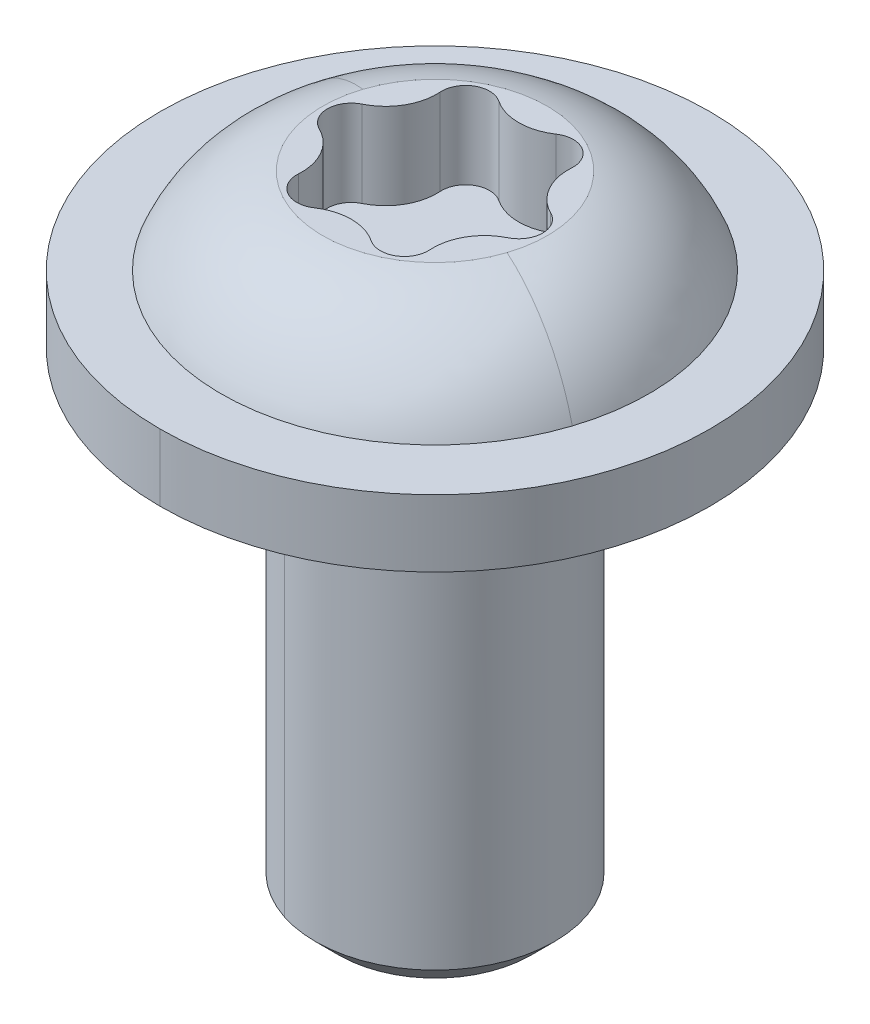
ISO-10303-21;
HEADER;
FILE_DESCRIPTION(('STEP AP214'),'2;1');
FILE_NAME('part.step','',(''),(''),'','','');
FILE_SCHEMA(('AUTOMOTIVE_DESIGN { 1 0 10303 214 1 1 1 1 }'));
ENDSEC;
DATA;
#1=APPLICATION_CONTEXT('core data for automotive mechanical design processes');
#2=APPLICATION_PROTOCOL_DEFINITION('international standard','automotive_design',2000,#1);
#3=PRODUCT_CONTEXT('',#1,'mechanical');
#4=PRODUCT('Part','Part','',(#3));
#5=PRODUCT_RELATED_PRODUCT_CATEGORY('part','',(#4));
#6=PRODUCT_DEFINITION_FORMATION('','',#4);
#7=PRODUCT_DEFINITION_CONTEXT('part definition',#1,'design');
#8=PRODUCT_DEFINITION('design','',#6,#7);
#9=PRODUCT_DEFINITION_SHAPE('','',#8);
#10=(LENGTH_UNIT() NAMED_UNIT(*) SI_UNIT(.MILLI.,.METRE.));
#11=(NAMED_UNIT(*) PLANE_ANGLE_UNIT() SI_UNIT($,.RADIAN.));
#12=(NAMED_UNIT(*) SI_UNIT($,.STERADIAN.) SOLID_ANGLE_UNIT());
#13=UNCERTAINTY_MEASURE_WITH_UNIT(LENGTH_MEASURE(1.E-05),#10,'distance_accuracy_value','');
#14=(GEOMETRIC_REPRESENTATION_CONTEXT(3) GLOBAL_UNCERTAINTY_ASSIGNED_CONTEXT((#13)) GLOBAL_UNIT_ASSIGNED_CONTEXT((#10,
#11,#12)) REPRESENTATION_CONTEXT('',''));
#15=CARTESIAN_POINT('',(0.,0.,0.));
#16=DIRECTION('',(0.,0.,1.));
#17=DIRECTION('',(1.,0.,0.));
#18=AXIS2_PLACEMENT_3D('',#15,#16,#17);
#19=CARTESIAN_POINT('',(0.,4.45,0.));
#20=DIRECTION('',(0.,-1.,0.));
#21=DIRECTION('',(0.,0.,-1.));
#22=AXIS2_PLACEMENT_3D('',#19,#20,#21);
#23=PLANE('',#22);
#24=CARTESIAN_POINT('',(0.,4.45,0.));
#25=DIRECTION('',(0.,-1.,0.));
#26=DIRECTION('',(0.,0.,-1.));
#27=AXIS2_PLACEMENT_3D('',#24,#25,#26);
#28=CIRCLE('',#27,2.3483115642632);
#29=CARTESIAN_POINT('',(2.23337701548378,4.45,0.725668181444543));
#30=VERTEX_POINT('',#29);
#31=CARTESIAN_POINT('',(-2.23337701548377,4.45,-0.725668181444542));
#32=VERTEX_POINT('',#31);
#33=EDGE_CURVE('E11',#30,#32,#28,.T.);
#34=ORIENTED_EDGE('',*,*,#33,.F.);
#35=CARTESIAN_POINT('',(0.,4.45,0.));
#36=DIRECTION('',(0.,-1.,0.));
#37=DIRECTION('',(-0.951056516295154,0.,-0.309016994374947));
#38=AXIS2_PLACEMENT_3D('',#35,#36,#37);
#39=CIRCLE('',#38,2.3483115642632);
#40=EDGE_CURVE('E25',#32,#30,#39,.T.);
#41=ORIENTED_EDGE('',*,*,#40,.F.);
#42=EDGE_LOOP('',(#34,#41));
#43=FACE_BOUND('',#42,.T.);
#44=CARTESIAN_POINT('',(-2.44608875298927,4.45,-1.41225000000003));
#45=DIRECTION('',(0.,1.,0.));
#46=DIRECTION('',(1.,0.,0.));
#47=AXIS2_PLACEMENT_3D('',#44,#45,#46);
#48=CIRCLE('',#47,1.07400000000008);
#49=CARTESIAN_POINT('',(-1.971863388078,4.45,-0.44861817026683));
#50=VERTEX_POINT('',#49);
#51=CARTESIAN_POINT('',(-1.3744464276497,4.45,-1.4833747252437));
#52=VERTEX_POINT('',#51);
#53=EDGE_CURVE('E513',#50,#52,#48,.T.);
#54=ORIENTED_EDGE('',*,*,#53,.T.);
#55=CARTESIAN_POINT('',(-0.875544039264562,4.45,-1.51648676027024));
#56=DIRECTION('',(0.,1.,0.));
#57=DIRECTION('',(1.,0.,0.));
#58=AXIS2_PLACEMENT_3D('',#55,#56,#57);
#59=CIRCLE('',#58,0.499999999999994);
#60=CARTESIAN_POINT('',(-0.59741696198863,4.45,-1.9319928720014));
#61=VERTEX_POINT('',#60);
#62=EDGE_CURVE('E507',#61,#52,#59,.T.);
#63=ORIENTED_EDGE('',*,*,#62,.F.);
#64=CARTESIAN_POINT('',(0.,4.45,-2.82450000000008));
#65=DIRECTION('',(0.,1.,0.));
#66=DIRECTION('',(1.,0.,0.));
#67=AXIS2_PLACEMENT_3D('',#64,#65,#66);
#68=CIRCLE('',#67,1.07400000000008);
#69=CARTESIAN_POINT('',(0.59741696198862,4.45,-1.9319928720014));
#70=VERTEX_POINT('',#69);
#71=EDGE_CURVE('E502',#61,#70,#68,.T.);
#72=ORIENTED_EDGE('',*,*,#71,.T.);
#73=CARTESIAN_POINT('',(0.875544039264487,4.45,-1.51648676027013));
#74=DIRECTION('',(0.,1.,0.));
#75=DIRECTION('',(1.,0.,0.));
#76=AXIS2_PLACEMENT_3D('',#73,#74,#75);
#77=CIRCLE('',#76,0.500000000000055);
#78=CARTESIAN_POINT('',(1.3744464260894,4.45,-1.4833747017346));
#79=VERTEX_POINT('',#78);
#80=EDGE_CURVE('E496',#79,#70,#77,.T.);
#81=ORIENTED_EDGE('',*,*,#80,.F.);
#82=CARTESIAN_POINT('',(2.44608875298921,4.45,-1.41225000000003));
#83=DIRECTION('',(0.,1.,0.));
#84=DIRECTION('',(1.,0.,0.));
#85=AXIS2_PLACEMENT_3D('',#82,#83,#84);
#86=CIRCLE('',#85,1.07400000000003);
#87=CARTESIAN_POINT('',(1.9718634014479,4.45,-0.44861816368722));
#88=VERTEX_POINT('',#87);
#89=EDGE_CURVE('E491',#79,#88,#86,.T.);
#90=ORIENTED_EDGE('',*,*,#89,.T.);
#91=CARTESIAN_POINT('',(1.75108807852895,4.45,0.));
#92=DIRECTION('',(0.,-1.,0.));
#93=DIRECTION('',(0.,0.,-1.));
#94=AXIS2_PLACEMENT_3D('',#91,#92,#93);
#95=CIRCLE('',#94,0.500000000000056);
#96=CARTESIAN_POINT('',(1.971863388078,4.45,0.44861817026684));
#97=VERTEX_POINT('',#96);
#98=EDGE_CURVE('E486',#88,#97,#95,.T.);
#99=ORIENTED_EDGE('',*,*,#98,.T.);
#100=CARTESIAN_POINT('',(2.44608875298927,4.45,1.41225000000006));
#101=DIRECTION('',(0.,1.,0.));
#102=DIRECTION('',(1.,0.,0.));
#103=AXIS2_PLACEMENT_3D('',#100,#101,#102);
#104=CIRCLE('',#103,1.07400000000011);
#105=CARTESIAN_POINT('',(1.3744464270762,4.45,1.483374716603));
#106=VERTEX_POINT('',#105);
#107=EDGE_CURVE('E481',#97,#106,#104,.T.);
#108=ORIENTED_EDGE('',*,*,#107,.T.);
#109=CARTESIAN_POINT('',(0.875544039264562,4.45,1.51648676027026));
#110=DIRECTION('',(0.,1.,0.));
#111=DIRECTION('',(1.,0.,0.));
#112=AXIS2_PLACEMENT_3D('',#109,#110,#111);
#113=CIRCLE('',#112,0.499999999999978);
#114=CARTESIAN_POINT('',(0.59741696198863,4.45,1.9319928720014));
#115=VERTEX_POINT('',#114);
#116=EDGE_CURVE('E475',#115,#106,#113,.T.);
#117=ORIENTED_EDGE('',*,*,#116,.F.);
#118=CARTESIAN_POINT('',(0.,4.45,2.82450000000016));
#119=DIRECTION('',(0.,1.,0.));
#120=DIRECTION('',(1.,0.,0.));
#121=AXIS2_PLACEMENT_3D('',#118,#119,#120);
#122=CIRCLE('',#121,1.07400000000016);
#123=CARTESIAN_POINT('',(-0.59741697437167,4.45,1.9319928802902));
#124=VERTEX_POINT('',#123);
#125=EDGE_CURVE('E470',#115,#124,#122,.T.);
#126=ORIENTED_EDGE('',*,*,#125,.T.);
#127=CARTESIAN_POINT('',(-0.875544039264514,4.45,1.51648676027015));
#128=DIRECTION('',(0.,1.,0.));
#129=DIRECTION('',(1.,0.,0.));
#130=AXIS2_PLACEMENT_3D('',#127,#128,#129);
#131=CIRCLE('',#130,0.50000000000003);
#132=CARTESIAN_POINT('',(-1.3744464260894,4.45,1.4833747017346));
#133=VERTEX_POINT('',#132);
#134=EDGE_CURVE('E464',#133,#124,#131,.T.);
#135=ORIENTED_EDGE('',*,*,#134,.F.);
#136=CARTESIAN_POINT('',(-2.44608875298927,4.45,1.41225000000004));
#137=DIRECTION('',(0.,1.,0.));
#138=DIRECTION('',(1.,0.,0.));
#139=AXIS2_PLACEMENT_3D('',#136,#137,#138);
#140=CIRCLE('',#139,1.07400000000009);
#141=CARTESIAN_POINT('',(-1.9718633680232,4.45,0.44861818013626));
#142=VERTEX_POINT('',#141);
#143=EDGE_CURVE('E459',#133,#142,#140,.T.);
#144=ORIENTED_EDGE('',*,*,#143,.T.);
#145=CARTESIAN_POINT('',(-1.75108807852897,4.45,0.));
#146=DIRECTION('',(0.,1.,0.));
#147=DIRECTION('',(1.,0.,0.));
#148=AXIS2_PLACEMENT_3D('',#145,#146,#147);
#149=CIRCLE('',#148,0.500000000000029);
#150=EDGE_CURVE('E453',#50,#142,#149,.T.);
#151=ORIENTED_EDGE('',*,*,#150,.F.);
#152=EDGE_LOOP('',(#54,#63,#72,#81,#90,#99,#108,#117,#126,#135,#144,#151));
#153=FACE_BOUND('',#152,.T.);
#154=ADVANCED_FACE('F16',(#43,#153),#23,.F.);
#155=CARTESIAN_POINT('',(-1.75108807852897,2.65,0.));
#156=DIRECTION('',(0.,1.,0.));
#157=DIRECTION('',(1.,0.,-2.23517959084227E-08));
#158=AXIS2_PLACEMENT_3D('',#155,#156,#157);
#159=CYLINDRICAL_SURFACE('',#158,0.500000000000029);
#160=ORIENTED_EDGE('',*,*,#150,.T.);
#161=DIRECTION('',(0.,1.,0.));
#162=VECTOR('',#161,1.);
#163=CARTESIAN_POINT('',(-1.9718633680232,2.65,0.44861818013626));
#164=LINE('',#163,#162);
#165=CARTESIAN_POINT('',(-1.9718633680232,2.65,0.44861818013626));
#166=VERTEX_POINT('',#165);
#167=EDGE_CURVE('E447',#166,#142,#164,.T.);
#168=ORIENTED_EDGE('',*,*,#167,.F.);
#169=CARTESIAN_POINT('',(-1.75108807852897,2.65,0.));
#170=DIRECTION('',(0.,1.,0.));
#171=DIRECTION('',(1.,0.,0.));
#172=AXIS2_PLACEMENT_3D('',#169,#170,#171);
#173=CIRCLE('',#172,0.500000000000029);
#174=CARTESIAN_POINT('',(-1.971863388078,2.65,-0.44861817026683));
#175=VERTEX_POINT('',#174);
#176=EDGE_CURVE('E441',#175,#166,#173,.T.);
#177=ORIENTED_EDGE('',*,*,#176,.F.);
#178=DIRECTION('',(0.,1.,0.));
#179=VECTOR('',#178,1.);
#180=CARTESIAN_POINT('',(-1.971863388078,2.65,-0.44861817026683));
#181=LINE('',#180,#179);
#182=EDGE_CURVE('E435',#175,#50,#181,.T.);
#183=ORIENTED_EDGE('',*,*,#182,.T.);
#184=EDGE_LOOP('',(#160,#168,#177,#183));
#185=FACE_BOUND('',#184,.T.);
#186=ADVANCED_FACE('F544',(#185),#159,.F.);
#187=CARTESIAN_POINT('',(-2.44608875298927,2.65,-1.41225000000003));
#188=DIRECTION('',(0.,1.,0.));
#189=DIRECTION('',(-0.866025405752577,0.,-0.499999996591083));
#190=AXIS2_PLACEMENT_3D('',#187,#188,#189);
#191=CYLINDRICAL_SURFACE('',#190,1.07400000000008);
#192=ORIENTED_EDGE('',*,*,#53,.F.);
#193=ORIENTED_EDGE('',*,*,#182,.F.);
#194=CARTESIAN_POINT('',(-2.44608875298927,2.65,-1.41225000000003));
#195=DIRECTION('',(0.,1.,0.));
#196=DIRECTION('',(1.,0.,0.));
#197=AXIS2_PLACEMENT_3D('',#194,#195,#196);
#198=CIRCLE('',#197,1.07400000000008);
#199=CARTESIAN_POINT('',(-1.3744464276497,2.65,-1.4833747252437));
#200=VERTEX_POINT('',#199);
#201=EDGE_CURVE('E430',#175,#200,#198,.T.);
#202=ORIENTED_EDGE('',*,*,#201,.T.);
#203=DIRECTION('',(0.,1.,0.));
#204=VECTOR('',#203,1.);
#205=CARTESIAN_POINT('',(-1.3744464276497,2.65,-1.4833747252437));
#206=LINE('',#205,#204);
#207=EDGE_CURVE('E424',#200,#52,#206,.T.);
#208=ORIENTED_EDGE('',*,*,#207,.T.);
#209=EDGE_LOOP('',(#192,#193,#202,#208));
#210=FACE_BOUND('',#209,.T.);
#211=ADVANCED_FACE('F548',(#210),#191,.T.);
#212=CARTESIAN_POINT('',(-0.875544039264562,2.65,-1.51648676027024));
#213=DIRECTION('',(0.,1.,0.));
#214=DIRECTION('',(0.499999979595685,0.,0.866025415564875));
#215=AXIS2_PLACEMENT_3D('',#212,#213,#214);
#216=CYLINDRICAL_SURFACE('',#215,0.499999999999994);
#217=ORIENTED_EDGE('',*,*,#62,.T.);
#218=ORIENTED_EDGE('',*,*,#207,.F.);
#219=CARTESIAN_POINT('',(-0.875544039264562,2.65,-1.51648676027024));
#220=DIRECTION('',(0.,1.,0.));
#221=DIRECTION('',(1.,0.,0.));
#222=AXIS2_PLACEMENT_3D('',#219,#220,#221);
#223=CIRCLE('',#222,0.499999999999994);
#224=CARTESIAN_POINT('',(-0.59741696198863,2.65,-1.9319928720014));
#225=VERTEX_POINT('',#224);
#226=EDGE_CURVE('E418',#225,#200,#223,.T.);
#227=ORIENTED_EDGE('',*,*,#226,.F.);
#228=DIRECTION('',(0.,1.,0.));
#229=VECTOR('',#228,1.);
#230=CARTESIAN_POINT('',(-0.59741696198863,2.65,-1.9319928720014));
#231=LINE('',#230,#229);
#232=EDGE_CURVE('E412',#225,#61,#231,.T.);
#233=ORIENTED_EDGE('',*,*,#232,.T.);
#234=EDGE_LOOP('',(#217,#218,#227,#233));
#235=FACE_BOUND('',#234,.T.);
#236=ADVANCED_FACE('F557',(#235),#216,.F.);
#237=CARTESIAN_POINT('',(0.,2.65,-2.82450000000008));
#238=DIRECTION('',(0.,1.,0.));
#239=DIRECTION('',(0.,0.,-1.));
#240=AXIS2_PLACEMENT_3D('',#237,#238,#239);
#241=CYLINDRICAL_SURFACE('',#240,1.07400000000008);
#242=ORIENTED_EDGE('',*,*,#71,.F.);
#243=ORIENTED_EDGE('',*,*,#232,.F.);
#244=CARTESIAN_POINT('',(0.,2.65,-2.82450000000008));
#245=DIRECTION('',(0.,1.,0.));
#246=DIRECTION('',(1.,0.,0.));
#247=AXIS2_PLACEMENT_3D('',#244,#245,#246);
#248=CIRCLE('',#247,1.07400000000008);
#249=CARTESIAN_POINT('',(0.59741696198862,2.65,-1.9319928720014));
#250=VERTEX_POINT('',#249);
#251=EDGE_CURVE('E407',#225,#250,#248,.T.);
#252=ORIENTED_EDGE('',*,*,#251,.T.);
#253=DIRECTION('',(0.,1.,0.));
#254=VECTOR('',#253,1.);
#255=CARTESIAN_POINT('',(0.59741696198862,2.65,-1.9319928720014));
#256=LINE('',#255,#254);
#257=EDGE_CURVE('E401',#250,#70,#256,.T.);
#258=ORIENTED_EDGE('',*,*,#257,.T.);
#259=EDGE_LOOP('',(#242,#243,#252,#258));
#260=FACE_BOUND('',#259,.T.);
#261=ADVANCED_FACE('F562',(#260),#241,.T.);
#262=CARTESIAN_POINT('',(0.875544039264487,2.65,-1.51648676027013));
#263=DIRECTION('',(0.,1.,0.));
#264=DIRECTION('',(-0.499999999999954,0.,0.866025403784466));
#265=AXIS2_PLACEMENT_3D('',#262,#263,#264);
#266=CYLINDRICAL_SURFACE('',#265,0.500000000000055);
#267=ORIENTED_EDGE('',*,*,#80,.T.);
#268=ORIENTED_EDGE('',*,*,#257,.F.);
#269=CARTESIAN_POINT('',(0.875544039264487,2.65,-1.51648676027013));
#270=DIRECTION('',(0.,1.,0.));
#271=DIRECTION('',(1.,0.,0.));
#272=AXIS2_PLACEMENT_3D('',#269,#270,#271);
#273=CIRCLE('',#272,0.500000000000055);
#274=CARTESIAN_POINT('',(1.3744464260894,2.65,-1.4833747017346));
#275=VERTEX_POINT('',#274);
#276=EDGE_CURVE('E395',#275,#250,#273,.T.);
#277=ORIENTED_EDGE('',*,*,#276,.F.);
#278=DIRECTION('',(0.,1.,0.));
#279=VECTOR('',#278,1.);
#280=CARTESIAN_POINT('',(1.3744464260894,2.65,-1.4833747017346));
#281=LINE('',#280,#279);
#282=EDGE_CURVE('E389',#275,#79,#281,.T.);
#283=ORIENTED_EDGE('',*,*,#282,.T.);
#284=EDGE_LOOP('',(#267,#268,#277,#283));
#285=FACE_BOUND('',#284,.T.);
#286=ADVANCED_FACE('F567',(#285),#266,.F.);
#287=CARTESIAN_POINT('',(2.44608875298921,2.65,-1.41225000000003));
#288=DIRECTION('',(0.,1.,0.));
#289=DIRECTION('',(0.866025396799578,0.,-0.500000012098133));
#290=AXIS2_PLACEMENT_3D('',#287,#288,#289);
#291=CYLINDRICAL_SURFACE('',#290,1.07400000000003);
#292=ORIENTED_EDGE('',*,*,#89,.F.);
#293=ORIENTED_EDGE('',*,*,#282,.F.);
#294=CARTESIAN_POINT('',(2.44608875298921,2.65,-1.41225000000003));
#295=DIRECTION('',(0.,1.,0.));
#296=DIRECTION('',(1.,0.,0.));
#297=AXIS2_PLACEMENT_3D('',#294,#295,#296);
#298=CIRCLE('',#297,1.07400000000003);
#299=CARTESIAN_POINT('',(1.9718634014479,2.65,-0.44861816368722));
#300=VERTEX_POINT('',#299);
#301=EDGE_CURVE('E384',#275,#300,#298,.T.);
#302=ORIENTED_EDGE('',*,*,#301,.T.);
#303=DIRECTION('',(0.,1.,0.));
#304=VECTOR('',#303,1.);
#305=CARTESIAN_POINT('',(1.9718634014479,2.65,-0.44861816368722));
#306=LINE('',#305,#304);
#307=EDGE_CURVE('E378',#300,#88,#306,.T.);
#308=ORIENTED_EDGE('',*,*,#307,.T.);
#309=EDGE_LOOP('',(#292,#293,#302,#308));
#310=FACE_BOUND('',#309,.T.);
#311=ADVANCED_FACE('F570',(#310),#291,.T.);
#312=CARTESIAN_POINT('',(1.75108807852895,2.65,0.));
#313=DIRECTION('',(0.,1.,0.));
#314=DIRECTION('',(-1.,0.,-1.49012344073349E-08));
#315=AXIS2_PLACEMENT_3D('',#312,#313,#314);
#316=CYLINDRICAL_SURFACE('',#315,0.500000000000056);
#317=DIRECTION('',(0.,1.,0.));
#318=VECTOR('',#317,1.);
#319=CARTESIAN_POINT('',(1.971863388078,2.65,0.44861817026684));
#320=LINE('',#319,#318);
#321=CARTESIAN_POINT('',(1.971863388078,2.65,0.44861817026684));
#322=VERTEX_POINT('',#321);
#323=EDGE_CURVE('E372',#322,#97,#320,.T.);
#324=ORIENTED_EDGE('',*,*,#323,.T.);
#325=ORIENTED_EDGE('',*,*,#98,.F.);
#326=ORIENTED_EDGE('',*,*,#307,.F.);
#327=CARTESIAN_POINT('',(1.75108807852895,2.65,0.));
#328=DIRECTION('',(0.,1.,0.));
#329=DIRECTION('',(1.,0.,0.));
#330=AXIS2_PLACEMENT_3D('',#327,#328,#329);
#331=CIRCLE('',#330,0.500000000000056);
#332=EDGE_CURVE('E366',#322,#300,#331,.T.);
#333=ORIENTED_EDGE('',*,*,#332,.F.);
#334=EDGE_LOOP('',(#324,#325,#326,#333));
#335=FACE_BOUND('',#334,.T.);
#336=ADVANCED_FACE('F574',(#335),#316,.F.);
#337=CARTESIAN_POINT('',(-1.66081639612691,2.65,-1.46436838013514));
#338=DIRECTION('',(0.,1.,0.));
#339=DIRECTION('',(0.,0.,1.));
#340=AXIS2_PLACEMENT_3D('',#337,#338,#339);
#341=PLANE('',#340);
#342=ORIENTED_EDGE('',*,*,#201,.F.);
#343=ORIENTED_EDGE('',*,*,#176,.T.);
#344=CARTESIAN_POINT('',(-2.44608875298927,2.65,1.41225000000004));
#345=DIRECTION('',(0.,1.,0.));
#346=DIRECTION('',(1.,0.,0.));
#347=AXIS2_PLACEMENT_3D('',#344,#345,#346);
#348=CIRCLE('',#347,1.07400000000009);
#349=CARTESIAN_POINT('',(-1.3744464260894,2.65,1.4833747017346));
#350=VERTEX_POINT('',#349);
#351=EDGE_CURVE('E360',#350,#166,#348,.T.);
#352=ORIENTED_EDGE('',*,*,#351,.F.);
#353=CARTESIAN_POINT('',(-0.875544039264514,2.65,1.51648676027015));
#354=DIRECTION('',(0.,1.,0.));
#355=DIRECTION('',(1.,0.,0.));
#356=AXIS2_PLACEMENT_3D('',#353,#354,#355);
#357=CIRCLE('',#356,0.50000000000003);
#358=CARTESIAN_POINT('',(-0.59741697437167,2.65,1.9319928802902));
#359=VERTEX_POINT('',#358);
#360=EDGE_CURVE('E355',#350,#359,#357,.T.);
#361=ORIENTED_EDGE('',*,*,#360,.T.);
#362=CARTESIAN_POINT('',(0.,2.65,2.82450000000016));
#363=DIRECTION('',(0.,1.,0.));
#364=DIRECTION('',(1.,0.,0.));
#365=AXIS2_PLACEMENT_3D('',#362,#363,#364);
#366=CIRCLE('',#365,1.07400000000016);
#367=CARTESIAN_POINT('',(0.59741696198863,2.65,1.9319928720014));
#368=VERTEX_POINT('',#367);
#369=EDGE_CURVE('E349',#368,#359,#366,.T.);
#370=ORIENTED_EDGE('',*,*,#369,.F.);
#371=CARTESIAN_POINT('',(0.875544039264562,2.65,1.51648676027026));
#372=DIRECTION('',(0.,1.,0.));
#373=DIRECTION('',(1.,0.,0.));
#374=AXIS2_PLACEMENT_3D('',#371,#372,#373);
#375=CIRCLE('',#374,0.499999999999978);
#376=CARTESIAN_POINT('',(1.3744464270762,2.65,1.483374716603));
#377=VERTEX_POINT('',#376);
#378=EDGE_CURVE('E344',#368,#377,#375,.T.);
#379=ORIENTED_EDGE('',*,*,#378,.T.);
#380=CARTESIAN_POINT('',(2.44608875298927,2.65,1.41225000000006));
#381=DIRECTION('',(0.,1.,0.));
#382=DIRECTION('',(1.,0.,0.));
#383=AXIS2_PLACEMENT_3D('',#380,#381,#382);
#384=CIRCLE('',#383,1.07400000000011);
#385=EDGE_CURVE('E338',#322,#377,#384,.T.);
#386=ORIENTED_EDGE('',*,*,#385,.F.);
#387=ORIENTED_EDGE('',*,*,#332,.T.);
#388=ORIENTED_EDGE('',*,*,#301,.F.);
#389=ORIENTED_EDGE('',*,*,#276,.T.);
#390=ORIENTED_EDGE('',*,*,#251,.F.);
#391=ORIENTED_EDGE('',*,*,#226,.T.);
#392=EDGE_LOOP('',(#342,#343,#352,#361,#370,#379,#386,#387,#388,#389,#390,#391));
#393=FACE_BOUND('',#392,.T.);
#394=ADVANCED_FACE('F596',(#393),#341,.T.);
#395=CARTESIAN_POINT('',(2.44608875298927,2.65,1.41225000000006));
#396=DIRECTION('',(0.,1.,0.));
#397=DIRECTION('',(0.866025403736808,0.,0.500000000082499));
#398=AXIS2_PLACEMENT_3D('',#395,#396,#397);
#399=CYLINDRICAL_SURFACE('',#398,1.07400000000011);
#400=ORIENTED_EDGE('',*,*,#107,.F.);
#401=ORIENTED_EDGE('',*,*,#323,.F.);
#402=ORIENTED_EDGE('',*,*,#385,.T.);
#403=DIRECTION('',(0.,1.,0.));
#404=VECTOR('',#403,1.);
#405=CARTESIAN_POINT('',(1.3744464270762,2.65,1.483374716603));
#406=LINE('',#405,#404);
#407=EDGE_CURVE('E332',#377,#106,#406,.T.);
#408=ORIENTED_EDGE('',*,*,#407,.T.);
#409=EDGE_LOOP('',(#400,#401,#402,#408));
#410=FACE_BOUND('',#409,.T.);
#411=ADVANCED_FACE('F578',(#410),#399,.T.);
#412=CARTESIAN_POINT('',(0.875544039264562,2.65,1.51648676027026));
#413=DIRECTION('',(0.,1.,0.));
#414=DIRECTION('',(-0.499999987095222,0.,-0.866025411235015));
#415=AXIS2_PLACEMENT_3D('',#412,#413,#414);
#416=CYLINDRICAL_SURFACE('',#415,0.499999999999978);
#417=ORIENTED_EDGE('',*,*,#116,.T.);
#418=ORIENTED_EDGE('',*,*,#407,.F.);
#419=ORIENTED_EDGE('',*,*,#378,.F.);
#420=DIRECTION('',(0.,1.,0.));
#421=VECTOR('',#420,1.);
#422=CARTESIAN_POINT('',(0.59741696198863,2.65,1.9319928720014));
#423=LINE('',#422,#421);
#424=EDGE_CURVE('E326',#368,#115,#423,.T.);
#425=ORIENTED_EDGE('',*,*,#424,.T.);
#426=EDGE_LOOP('',(#417,#418,#419,#425));
#427=FACE_BOUND('',#426,.T.);
#428=ADVANCED_FACE('F583',(#427),#416,.F.);
#429=CARTESIAN_POINT('',(0.,2.65,2.82450000000016));
#430=DIRECTION('',(0.,1.,0.));
#431=DIRECTION('',(0.,0.,1.));
#432=AXIS2_PLACEMENT_3D('',#429,#430,#431);
#433=CYLINDRICAL_SURFACE('',#432,1.07400000000016);
#434=ORIENTED_EDGE('',*,*,#125,.F.);
#435=ORIENTED_EDGE('',*,*,#424,.F.);
#436=ORIENTED_EDGE('',*,*,#369,.T.);
#437=DIRECTION('',(0.,1.,0.));
#438=VECTOR('',#437,1.);
#439=CARTESIAN_POINT('',(-0.59741697437167,2.65,1.9319928802902));
#440=LINE('',#439,#438);
#441=EDGE_CURVE('E320',#359,#124,#440,.T.);
#442=ORIENTED_EDGE('',*,*,#441,.T.);
#443=EDGE_LOOP('',(#434,#435,#436,#442));
#444=FACE_BOUND('',#443,.T.);
#445=ADVANCED_FACE('F588',(#444),#433,.T.);
#446=CARTESIAN_POINT('',(-0.875544039264514,2.65,1.51648676027015));
#447=DIRECTION('',(0.,1.,0.));
#448=DIRECTION('',(0.500000012904712,0.,-0.8660253963339));
#449=AXIS2_PLACEMENT_3D('',#446,#447,#448);
#450=CYLINDRICAL_SURFACE('',#449,0.50000000000003);
#451=ORIENTED_EDGE('',*,*,#134,.T.);
#452=ORIENTED_EDGE('',*,*,#441,.F.);
#453=ORIENTED_EDGE('',*,*,#360,.F.);
#454=DIRECTION('',(0.,1.,0.));
#455=VECTOR('',#454,1.);
#456=CARTESIAN_POINT('',(-1.3744464260894,2.65,1.4833747017346));
#457=LINE('',#456,#455);
#458=EDGE_CURVE('E314',#350,#133,#457,.T.);
#459=ORIENTED_EDGE('',*,*,#458,.T.);
#460=EDGE_LOOP('',(#451,#452,#453,#459));
#461=FACE_BOUND('',#460,.T.);
#462=ADVANCED_FACE('F591',(#461),#450,.F.);
#463=CARTESIAN_POINT('',(-2.44608875298927,2.65,1.41225000000004));
#464=DIRECTION('',(0.,1.,0.));
#465=DIRECTION('',(-0.866025405471145,0.,0.49999999707854));
#466=AXIS2_PLACEMENT_3D('',#463,#464,#465);
#467=CYLINDRICAL_SURFACE('',#466,1.07400000000009);
#468=ORIENTED_EDGE('',*,*,#143,.F.);
#469=ORIENTED_EDGE('',*,*,#458,.F.);
#470=ORIENTED_EDGE('',*,*,#351,.T.);
#471=ORIENTED_EDGE('',*,*,#167,.T.);
#472=EDGE_LOOP('',(#468,#469,#470,#471));
#473=FACE_BOUND('',#472,.T.);
#474=ADVANCED_FACE('F541',(#473),#467,.T.);
#475=CARTESIAN_POINT('',(0.,1.52199999999986,0.));
#476=DIRECTION('',(0.,-1.,0.));
#477=DIRECTION('',(-0.309016994374947,0.,0.951056516295154));
#478=AXIS2_PLACEMENT_3D('',#475,#476,#477);
#479=DEGENERATE_TOROIDAL_SURFACE('',#478,1.69499999999989,3.00000000000017,.T.);
#480=CARTESIAN_POINT('',(-1.61204079512018,1.52199999999986,-0.5237838054655));
#481=DIRECTION('',(0.309016994374947,0.,-0.951056516295154));
#482=DIRECTION('',(-0.881267668696111,0.376000000000029,-0.286341223212622));
#483=AXIS2_PLACEMENT_3D('',#480,#481,#482);
#484=CIRCLE('',#483,3.00000000000017);
#485=CARTESIAN_POINT('',(-4.25584380120866,2.65000000000001,-1.38280747510341));
#486=VERTEX_POINT('',#485);
#487=EDGE_CURVE('E309',#486,#32,#484,.T.);
#488=ORIENTED_EDGE('',*,*,#487,.T.);
#489=ORIENTED_EDGE('',*,*,#40,.T.);
#490=CARTESIAN_POINT('',(1.61204079512018,1.52199999999986,0.5237838054655));
#491=DIRECTION('',(-0.309016994374947,0.,0.951056516295154));
#492=DIRECTION('',(0.881267668696111,0.376000000000028,0.286341223212622));
#493=AXIS2_PLACEMENT_3D('',#490,#491,#492);
#494=CIRCLE('',#493,3.00000000000017);
#495=CARTESIAN_POINT('',(4.25584380120866,2.65,1.38280747510341));
#496=VERTEX_POINT('',#495);
#497=EDGE_CURVE('E304',#496,#30,#494,.T.);
#498=ORIENTED_EDGE('',*,*,#497,.F.);
#499=CARTESIAN_POINT('',(0.,2.65,0.));
#500=DIRECTION('',(0.,-1.,0.));
#501=DIRECTION('',(-0.951056516295154,0.,-0.309016994374947));
#502=AXIS2_PLACEMENT_3D('',#499,#500,#501);
#503=CIRCLE('',#502,4.4748589892295);
#504=EDGE_CURVE('E299',#486,#496,#503,.T.);
#505=ORIENTED_EDGE('',*,*,#504,.F.);
#506=EDGE_LOOP('',(#488,#489,#498,#505));
#507=FACE_BOUND('',#506,.T.);
#508=ADVANCED_FACE('F524',(#507),#479,.T.);
#509=CARTESIAN_POINT('',(4.4748589892295,2.65,0.));
#510=DIRECTION('',(0.,-1.,0.));
#511=DIRECTION('',(0.,0.,-1.));
#512=AXIS2_PLACEMENT_3D('',#509,#510,#511);
#513=PLANE('',#512);
#514=CARTESIAN_POINT('',(0.,2.65,0.));
#515=DIRECTION('',(0.,-1.,0.));
#516=DIRECTION('',(0.,0.,-1.));
#517=AXIS2_PLACEMENT_3D('',#514,#515,#516);
#518=CIRCLE('',#517,5.75);
#519=CARTESIAN_POINT('',(0.,2.65,5.75));
#520=VERTEX_POINT('',#519);
#521=CARTESIAN_POINT('',(0.,2.65,-5.75));
#522=VERTEX_POINT('',#521);
#523=EDGE_CURVE('E293',#520,#522,#518,.T.);
#524=ORIENTED_EDGE('',*,*,#523,.F.);
#525=CARTESIAN_POINT('',(0.,2.65,0.));
#526=DIRECTION('',(0.,-1.,0.));
#527=DIRECTION('',(0.,0.,-1.));
#528=AXIS2_PLACEMENT_3D('',#525,#526,#527);
#529=CIRCLE('',#528,5.75);
#530=EDGE_CURVE('E287',#522,#520,#529,.T.);
#531=ORIENTED_EDGE('',*,*,#530,.F.);
#532=EDGE_LOOP('',(#524,#531));
#533=FACE_BOUND('',#532,.T.);
#534=ORIENTED_EDGE('',*,*,#504,.T.);
#535=CARTESIAN_POINT('',(0.,2.65,0.));
#536=DIRECTION('',(0.,-1.,0.));
#537=DIRECTION('',(0.,0.,-1.));
#538=AXIS2_PLACEMENT_3D('',#535,#536,#537);
#539=CIRCLE('',#538,4.4748589892295);
#540=EDGE_CURVE('E281',#496,#486,#539,.T.);
#541=ORIENTED_EDGE('',*,*,#540,.T.);
#542=EDGE_LOOP('',(#534,#541));
#543=FACE_BOUND('',#542,.T.);
#544=ADVANCED_FACE('F530',(#533,#543),#513,.F.);
#545=CARTESIAN_POINT('',(0.,1.52199999999986,0.));
#546=DIRECTION('',(0.,-1.,0.));
#547=DIRECTION('',(0.309016994374947,0.,-0.951056516295154));
#548=AXIS2_PLACEMENT_3D('',#545,#546,#547);
#549=DEGENERATE_TOROIDAL_SURFACE('',#548,1.69499999999989,3.00000000000017,.T.);
#550=ORIENTED_EDGE('',*,*,#487,.F.);
#551=ORIENTED_EDGE('',*,*,#540,.F.);
#552=ORIENTED_EDGE('',*,*,#497,.T.);
#553=ORIENTED_EDGE('',*,*,#33,.T.);
#554=EDGE_LOOP('',(#550,#551,#552,#553));
#555=FACE_BOUND('',#554,.T.);
#556=ADVANCED_FACE('F528',(#555),#549,.T.);
#557=CARTESIAN_POINT('',(0.,-8.75,0.));
#558=DIRECTION('',(0.,-1.,0.));
#559=DIRECTION('',(-1.,0.,0.));
#560=AXIS2_PLACEMENT_3D('',#557,#558,#559);
#561=CYLINDRICAL_SURFACE('',#560,5.75);
#562=DIRECTION('',(0.,-1.,0.));
#563=VECTOR('',#562,1.);
#564=CARTESIAN_POINT('',(0.,2.65,5.75));
#565=LINE('',#564,#563);
#566=CARTESIAN_POINT('',(0.,1.25,5.75));
#567=VERTEX_POINT('',#566);
#568=EDGE_CURVE('E276',#520,#567,#565,.T.);
#569=ORIENTED_EDGE('',*,*,#568,.T.);
#570=CARTESIAN_POINT('',(0.,1.25,0.));
#571=DIRECTION('',(0.,-1.,0.));
#572=DIRECTION('',(0.,0.,-1.));
#573=AXIS2_PLACEMENT_3D('',#570,#571,#572);
#574=CIRCLE('',#573,5.75);
#575=CARTESIAN_POINT('',(0.,1.25,-5.75));
#576=VERTEX_POINT('',#575);
#577=EDGE_CURVE('E270',#576,#567,#574,.T.);
#578=ORIENTED_EDGE('',*,*,#577,.F.);
#579=DIRECTION('',(0.,-1.,0.));
#580=VECTOR('',#579,1.);
#581=CARTESIAN_POINT('',(0.,2.65,-5.75));
#582=LINE('',#581,#580);
#583=EDGE_CURVE('E264',#522,#576,#582,.T.);
#584=ORIENTED_EDGE('',*,*,#583,.F.);
#585=ORIENTED_EDGE('',*,*,#530,.T.);
#586=EDGE_LOOP('',(#569,#578,#584,#585));
#587=FACE_BOUND('',#586,.T.);
#588=ADVANCED_FACE('F539',(#587),#561,.T.);
#589=CARTESIAN_POINT('',(0.,-8.75,0.));
#590=DIRECTION('',(0.,-1.,0.));
#591=DIRECTION('',(1.,0.,0.));
#592=AXIS2_PLACEMENT_3D('',#589,#590,#591);
#593=CYLINDRICAL_SURFACE('',#592,5.75);
#594=ORIENTED_EDGE('',*,*,#568,.F.);
#595=ORIENTED_EDGE('',*,*,#523,.T.);
#596=ORIENTED_EDGE('',*,*,#583,.T.);
#597=CARTESIAN_POINT('',(0.,1.25,0.));
#598=DIRECTION('',(0.,-1.,0.));
#599=DIRECTION('',(0.,0.,-1.));
#600=AXIS2_PLACEMENT_3D('',#597,#598,#599);
#601=CIRCLE('',#600,5.75);
#602=EDGE_CURVE('E258',#567,#576,#601,.T.);
#603=ORIENTED_EDGE('',*,*,#602,.F.);
#604=EDGE_LOOP('',(#594,#595,#596,#603));
#605=FACE_BOUND('',#604,.T.);
#606=ADVANCED_FACE('F715',(#605),#593,.T.);
#607=CARTESIAN_POINT('',(5.75,1.25,0.));
#608=DIRECTION('',(0.,1.,0.));
#609=DIRECTION('',(0.,0.,1.));
#610=AXIS2_PLACEMENT_3D('',#607,#608,#609);
#611=PLANE('',#610);
#612=CARTESIAN_POINT('',(0.,1.25,0.));
#613=DIRECTION('',(0.,-1.,0.));
#614=DIRECTION('',(0.,0.,-1.));
#615=AXIS2_PLACEMENT_3D('',#612,#613,#614);
#616=CIRCLE('',#615,2.5);
#617=CARTESIAN_POINT('',(-0.772542485937367,1.25,2.37764129073788));
#618=VERTEX_POINT('',#617);
#619=CARTESIAN_POINT('',(0.,1.25,-2.5));
#620=VERTEX_POINT('',#619);
#621=EDGE_CURVE('E252',#618,#620,#616,.T.);
#622=ORIENTED_EDGE('',*,*,#621,.F.);
#623=CARTESIAN_POINT('',(0.,1.25,0.));
#624=DIRECTION('',(0.,-1.,0.));
#625=DIRECTION('',(0.,0.,-1.));
#626=AXIS2_PLACEMENT_3D('',#623,#624,#625);
#627=CIRCLE('',#626,2.5);
#628=EDGE_CURVE('E246',#620,#618,#627,.T.);
#629=ORIENTED_EDGE('',*,*,#628,.F.);
#630=EDGE_LOOP('',(#622,#629));
#631=FACE_BOUND('',#630,.T.);
#632=ORIENTED_EDGE('',*,*,#577,.T.);
#633=ORIENTED_EDGE('',*,*,#602,.T.);
#634=EDGE_LOOP('',(#632,#633));
#635=FACE_BOUND('',#634,.T.);
#636=ADVANCED_FACE('F724',(#631,#635),#611,.F.);
#637=CARTESIAN_POINT('',(0.,-8.75,0.));
#638=DIRECTION('',(0.,-1.,0.));
#639=DIRECTION('',(-0.987688340595138,0.,-0.156434465040231));
#640=AXIS2_PLACEMENT_3D('',#637,#638,#639);
#641=CYLINDRICAL_SURFACE('',#640,2.5);
#642=DIRECTION('',(0.,-1.,0.));
#643=VECTOR('',#642,1.);
#644=CARTESIAN_POINT('',(-0.772542485937367,1.25,2.37764129073788));
#645=LINE('',#644,#643);
#646=CARTESIAN_POINT('',(-0.772542485937367,-8.25949999999999,2.37764129073788));
#647=VERTEX_POINT('',#646);
#648=EDGE_CURVE('E241',#618,#647,#645,.T.);
#649=ORIENTED_EDGE('',*,*,#648,.T.);
#650=CARTESIAN_POINT('',(0.,-8.2595,0.));
#651=DIRECTION('',(0.,-1.,0.));
#652=DIRECTION('',(0.,0.,-1.));
#653=AXIS2_PLACEMENT_3D('',#650,#651,#652);
#654=CIRCLE('',#653,2.5);
#655=CARTESIAN_POINT('',(0.,-8.2595,2.5));
#656=VERTEX_POINT('',#655);
#657=EDGE_CURVE('E237',#656,#647,#654,.T.);
#658=ORIENTED_EDGE('',*,*,#657,.F.);
#659=CARTESIAN_POINT('',(0.,-8.2595,0.));
#660=DIRECTION('',(0.,-1.,0.));
#661=DIRECTION('',(0.,0.,-1.));
#662=AXIS2_PLACEMENT_3D('',#659,#660,#661);
#663=CIRCLE('',#662,2.5);
#664=CARTESIAN_POINT('',(0.,-8.2595,-2.5));
#665=VERTEX_POINT('',#664);
#666=EDGE_CURVE('E207',#665,#656,#663,.T.);
#667=ORIENTED_EDGE('',*,*,#666,.F.);
#668=DIRECTION('',(0.,-1.,0.));
#669=VECTOR('',#668,1.);
#670=CARTESIAN_POINT('',(0.,1.25,-2.5));
#671=LINE('',#670,#669);
#672=EDGE_CURVE('E227',#620,#665,#671,.T.);
#673=ORIENTED_EDGE('',*,*,#672,.F.);
#674=ORIENTED_EDGE('',*,*,#628,.T.);
#675=EDGE_LOOP('',(#649,#658,#667,#673,#674));
#676=FACE_BOUND('',#675,.T.);
#677=ADVANCED_FACE('F735',(#676),#641,.T.);
#678=CARTESIAN_POINT('',(0.,-8.75,0.));
#679=DIRECTION('',(0.,-1.,0.));
#680=DIRECTION('',(0.987688340595138,0.,0.156434465040231));
#681=AXIS2_PLACEMENT_3D('',#678,#679,#680);
#682=CYLINDRICAL_SURFACE('',#681,2.5);
#683=ORIENTED_EDGE('',*,*,#648,.F.);
#684=ORIENTED_EDGE('',*,*,#621,.T.);
#685=ORIENTED_EDGE('',*,*,#672,.T.);
#686=CARTESIAN_POINT('',(0.,-8.2595,0.));
#687=DIRECTION('',(0.,-1.,0.));
#688=DIRECTION('',(0.,0.,-1.));
#689=AXIS2_PLACEMENT_3D('',#686,#687,#688);
#690=CIRCLE('',#689,2.5);
#691=EDGE_CURVE('E222',#647,#665,#690,.T.);
#692=ORIENTED_EDGE('',*,*,#691,.F.);
#693=EDGE_LOOP('',(#683,#684,#685,#692));
#694=FACE_BOUND('',#693,.T.);
#695=ADVANCED_FACE('F744',(#694),#682,.T.);
#696=CARTESIAN_POINT('',(0.,-8.2595,0.));
#697=DIRECTION('',(0.,1.,0.));
#698=DIRECTION('',(1.,0.,0.));
#699=AXIS2_PLACEMENT_3D('',#696,#697,#698);
#700=CONICAL_SURFACE('',#699,2.5,0.785398163397447);
#701=DIRECTION('',(0.,0.707106781186548,-0.707106781186547));
#702=VECTOR('',#701,1.);
#703=CARTESIAN_POINT('',(0.,-8.75,-2.0095));
#704=LINE('',#703,#702);
#705=CARTESIAN_POINT('',(0.,-8.75,-2.0095));
#706=VERTEX_POINT('',#705);
#707=EDGE_CURVE('E196',#706,#665,#704,.T.);
#708=ORIENTED_EDGE('',*,*,#707,.F.);
#709=CARTESIAN_POINT('',(0.,-8.75,0.));
#710=DIRECTION('',(0.,-1.,0.));
#711=DIRECTION('',(0.,0.,-1.));
#712=AXIS2_PLACEMENT_3D('',#709,#710,#711);
#713=CIRCLE('',#712,2.0095);
#714=CARTESIAN_POINT('',(0.,-8.75,2.0095));
#715=VERTEX_POINT('',#714);
#716=EDGE_CURVE('E187',#715,#706,#713,.T.);
#717=ORIENTED_EDGE('',*,*,#716,.F.);
#718=DIRECTION('',(0.,0.707106781186548,0.707106781186547));
#719=VECTOR('',#718,1.);
#720=CARTESIAN_POINT('',(0.,-8.75,2.0095));
#721=LINE('',#720,#719);
#722=EDGE_CURVE('E192',#715,#656,#721,.T.);
#723=ORIENTED_EDGE('',*,*,#722,.T.);
#724=ORIENTED_EDGE('',*,*,#657,.T.);
#725=ORIENTED_EDGE('',*,*,#691,.T.);
#726=EDGE_LOOP('',(#708,#717,#723,#724,#725));
#727=FACE_BOUND('',#726,.T.);
#728=ADVANCED_FACE('F189',(#727),#700,.T.);
#729=CARTESIAN_POINT('',(0.,-8.2595,0.));
#730=DIRECTION('',(0.,1.,0.));
#731=DIRECTION('',(-1.,0.,0.));
#732=AXIS2_PLACEMENT_3D('',#729,#730,#731);
#733=CONICAL_SURFACE('',#732,2.5,0.785398163397447);
#734=ORIENTED_EDGE('',*,*,#707,.T.);
#735=ORIENTED_EDGE('',*,*,#666,.T.);
#736=ORIENTED_EDGE('',*,*,#722,.F.);
#737=CARTESIAN_POINT('',(0.,-8.75,0.));
#738=DIRECTION('',(0.,-1.,0.));
#739=DIRECTION('',(0.,0.,-1.));
#740=AXIS2_PLACEMENT_3D('',#737,#738,#739);
#741=CIRCLE('',#740,2.0095);
#742=EDGE_CURVE('E201',#706,#715,#741,.T.);
#743=ORIENTED_EDGE('',*,*,#742,.F.);
#744=EDGE_LOOP('',(#734,#735,#736,#743));
#745=FACE_BOUND('',#744,.T.);
#746=ADVANCED_FACE('F206',(#745),#733,.T.);
#747=CARTESIAN_POINT('',(2.0095,-8.75,0.));
#748=DIRECTION('',(0.,1.,0.));
#749=DIRECTION('',(0.,0.,1.));
#750=AXIS2_PLACEMENT_3D('',#747,#748,#749);
#751=PLANE('',#750);
#752=ORIENTED_EDGE('',*,*,#742,.T.);
#753=ORIENTED_EDGE('',*,*,#716,.T.);
#754=EDGE_LOOP('',(#752,#753));
#755=FACE_BOUND('',#754,.T.);
#756=ADVANCED_FACE('F202',(#755),#751,.F.);
#757=CLOSED_SHELL('',(#154,#186,#211,#236,#261,#286,#311,#336,#394,#411,#428,#445,#462,#474,
#508,#544,#556,#588,#606,#636,#677,#695,#728,#746,#756));
#758=MANIFOLD_SOLID_BREP('B1',#757);
#759=ADVANCED_BREP_SHAPE_REPRESENTATION('',(#18,#758),#14);
#760=SHAPE_DEFINITION_REPRESENTATION(#9,#759);
ENDSEC;
END-ISO-10303-21;
